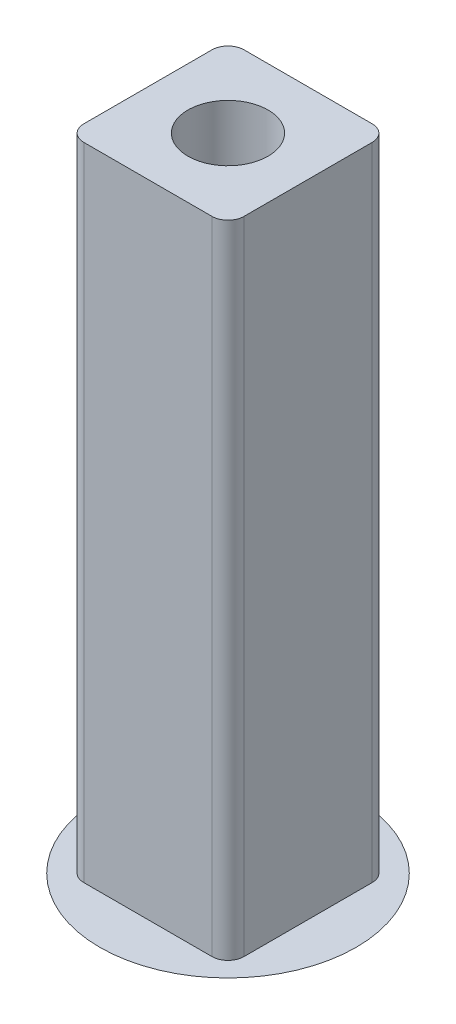
ISO-10303-21;
HEADER;
FILE_DESCRIPTION(('STEP AP214'),'2;1');
FILE_NAME('part.step','',(''),(''),'','','');
FILE_SCHEMA(('AUTOMOTIVE_DESIGN { 1 0 10303 214 1 1 1 1 }'));
ENDSEC;
DATA;
#1=APPLICATION_CONTEXT('core data for automotive mechanical design processes');
#2=APPLICATION_PROTOCOL_DEFINITION('international standard','automotive_design',2000,#1);
#3=PRODUCT_CONTEXT('',#1,'mechanical');
#4=PRODUCT('Part','Part','',(#3));
#5=PRODUCT_RELATED_PRODUCT_CATEGORY('part','',(#4));
#6=PRODUCT_DEFINITION_FORMATION('','',#4);
#7=PRODUCT_DEFINITION_CONTEXT('part definition',#1,'design');
#8=PRODUCT_DEFINITION('design','',#6,#7);
#9=PRODUCT_DEFINITION_SHAPE('','',#8);
#10=(LENGTH_UNIT() NAMED_UNIT(*) SI_UNIT(.MILLI.,.METRE.));
#11=(NAMED_UNIT(*) PLANE_ANGLE_UNIT() SI_UNIT($,.RADIAN.));
#12=(NAMED_UNIT(*) SI_UNIT($,.STERADIAN.) SOLID_ANGLE_UNIT());
#13=UNCERTAINTY_MEASURE_WITH_UNIT(LENGTH_MEASURE(1.E-05),#10,'distance_accuracy_value','');
#14=(GEOMETRIC_REPRESENTATION_CONTEXT(3) GLOBAL_UNCERTAINTY_ASSIGNED_CONTEXT((#13)) GLOBAL_UNIT_ASSIGNED_CONTEXT((#10,
#11,#12)) REPRESENTATION_CONTEXT('',''));
#15=CARTESIAN_POINT('',(0.,0.,0.));
#16=DIRECTION('',(0.,0.,1.));
#17=DIRECTION('',(1.,0.,0.));
#18=AXIS2_PLACEMENT_3D('',#15,#16,#17);
#19=CARTESIAN_POINT('',(2.,20.,-2.));
#20=DIRECTION('',(0.,-1.,0.));
#21=DIRECTION('',(0.,0.,-1.));
#22=AXIS2_PLACEMENT_3D('',#19,#20,#21);
#23=PLANE('',#22);
#24=CARTESIAN_POINT('',(2.,20.,-2.));
#25=DIRECTION('',(0.,1.,0.));
#26=DIRECTION('',(0.,0.,-1.));
#27=AXIS2_PLACEMENT_3D('',#24,#25,#26);
#28=CIRCLE('',#27,0.5);
#29=CARTESIAN_POINT('',(2.5,20.,-2.));
#30=VERTEX_POINT('',#29);
#31=CARTESIAN_POINT('',(2.,20.,-2.5));
#32=VERTEX_POINT('',#31);
#33=EDGE_CURVE('E125',#30,#32,#28,.T.);
#34=ORIENTED_EDGE('',*,*,#33,.T.);
#35=DIRECTION('',(-1.,0.,0.));
#36=VECTOR('',#35,1.);
#37=CARTESIAN_POINT('',(-2.,20.,-2.5));
#38=LINE('',#37,#36);
#39=CARTESIAN_POINT('',(-2.,20.,-2.5));
#40=VERTEX_POINT('',#39);
#41=EDGE_CURVE('E127',#32,#40,#38,.T.);
#42=ORIENTED_EDGE('',*,*,#41,.T.);
#43=CARTESIAN_POINT('',(-2.,20.,-2.));
#44=DIRECTION('',(0.,1.,0.));
#45=DIRECTION('',(0.,0.,-1.));
#46=AXIS2_PLACEMENT_3D('',#43,#44,#45);
#47=CIRCLE('',#46,0.5);
#48=CARTESIAN_POINT('',(-2.5,20.,-2.));
#49=VERTEX_POINT('',#48);
#50=EDGE_CURVE('E130',#40,#49,#47,.T.);
#51=ORIENTED_EDGE('',*,*,#50,.T.);
#52=DIRECTION('',(0.,0.,1.));
#53=VECTOR('',#52,1.);
#54=CARTESIAN_POINT('',(-2.5,20.,2.));
#55=LINE('',#54,#53);
#56=CARTESIAN_POINT('',(-2.5,20.,2.));
#57=VERTEX_POINT('',#56);
#58=EDGE_CURVE('E132',#49,#57,#55,.T.);
#59=ORIENTED_EDGE('',*,*,#58,.T.);
#60=CARTESIAN_POINT('',(-2.,20.,2.));
#61=DIRECTION('',(0.,1.,0.));
#62=DIRECTION('',(0.,0.,-1.));
#63=AXIS2_PLACEMENT_3D('',#60,#61,#62);
#64=CIRCLE('',#63,0.5);
#65=CARTESIAN_POINT('',(-2.,20.,2.5));
#66=VERTEX_POINT('',#65);
#67=EDGE_CURVE('E134',#57,#66,#64,.T.);
#68=ORIENTED_EDGE('',*,*,#67,.T.);
#69=DIRECTION('',(1.,0.,0.));
#70=VECTOR('',#69,1.);
#71=CARTESIAN_POINT('',(-2.,20.,2.5));
#72=LINE('',#71,#70);
#73=CARTESIAN_POINT('',(2.,20.,2.5));
#74=VERTEX_POINT('',#73);
#75=EDGE_CURVE('E136',#66,#74,#72,.T.);
#76=ORIENTED_EDGE('',*,*,#75,.T.);
#77=CARTESIAN_POINT('',(2.,20.,2.));
#78=DIRECTION('',(0.,1.,0.));
#79=DIRECTION('',(0.,0.,-1.));
#80=AXIS2_PLACEMENT_3D('',#77,#78,#79);
#81=CIRCLE('',#80,0.5);
#82=CARTESIAN_POINT('',(2.5,20.,2.));
#83=VERTEX_POINT('',#82);
#84=EDGE_CURVE('E138',#74,#83,#81,.T.);
#85=ORIENTED_EDGE('',*,*,#84,.T.);
#86=DIRECTION('',(0.,0.,-1.));
#87=VECTOR('',#86,1.);
#88=CARTESIAN_POINT('',(2.5,20.,2.));
#89=LINE('',#88,#87);
#90=EDGE_CURVE('E60',#83,#30,#89,.T.);
#91=ORIENTED_EDGE('',*,*,#90,.T.);
#92=EDGE_LOOP('',(#34,#42,#51,#59,#68,#76,#85,#91));
#93=FACE_BOUND('',#92,.T.);
#94=CARTESIAN_POINT('',(0.,20.,0.));
#95=DIRECTION('',(0.,1.,0.));
#96=DIRECTION('',(0.,0.,1.));
#97=AXIS2_PLACEMENT_3D('',#94,#95,#96);
#98=CIRCLE('',#97,1.25);
#99=CARTESIAN_POINT('',(0.,20.,1.25));
#100=VERTEX_POINT('',#99);
#101=EDGE_CURVE('E119',#100,#100,#98,.T.);
#102=ORIENTED_EDGE('',*,*,#101,.F.);
#103=EDGE_LOOP('',(#102));
#104=FACE_BOUND('',#103,.T.);
#105=ADVANCED_FACE('F44',(#93,#104),#23,.F.);
#106=CARTESIAN_POINT('',(2.,20.,-2.));
#107=DIRECTION('',(0.,-1.,0.));
#108=DIRECTION('',(0.,0.,-1.));
#109=AXIS2_PLACEMENT_3D('',#106,#107,#108);
#110=CYLINDRICAL_SURFACE('',#109,0.5);
#111=CARTESIAN_POINT('',(2.,0.,-2.));
#112=DIRECTION('',(0.,1.,0.));
#113=DIRECTION('',(0.,0.,-1.));
#114=AXIS2_PLACEMENT_3D('',#111,#112,#113);
#115=CIRCLE('',#114,0.5);
#116=CARTESIAN_POINT('',(2.5,0.,-2.));
#117=VERTEX_POINT('',#116);
#118=CARTESIAN_POINT('',(2.,0.,-2.5));
#119=VERTEX_POINT('',#118);
#120=EDGE_CURVE('E123',#117,#119,#115,.T.);
#121=ORIENTED_EDGE('',*,*,#120,.T.);
#122=DIRECTION('',(0.,-1.,0.));
#123=VECTOR('',#122,1.);
#124=CARTESIAN_POINT('',(2.,20.,-2.5));
#125=LINE('',#124,#123);
#126=EDGE_CURVE('E13',#32,#119,#125,.T.);
#127=ORIENTED_EDGE('',*,*,#126,.F.);
#128=ORIENTED_EDGE('',*,*,#33,.F.);
#129=DIRECTION('',(0.,-1.,0.));
#130=VECTOR('',#129,1.);
#131=CARTESIAN_POINT('',(2.5,20.,-2.));
#132=LINE('',#131,#130);
#133=EDGE_CURVE('E141',#30,#117,#132,.T.);
#134=ORIENTED_EDGE('',*,*,#133,.T.);
#135=EDGE_LOOP('',(#121,#127,#128,#134));
#136=FACE_BOUND('',#135,.T.);
#137=ADVANCED_FACE('F46',(#136),#110,.T.);
#138=CARTESIAN_POINT('',(-2.,20.,-2.5));
#139=DIRECTION('',(0.,0.,1.));
#140=DIRECTION('',(1.,0.,0.));
#141=AXIS2_PLACEMENT_3D('',#138,#139,#140);
#142=PLANE('',#141);
#143=DIRECTION('',(-1.,0.,0.));
#144=VECTOR('',#143,1.);
#145=CARTESIAN_POINT('',(-2.,0.,-2.5));
#146=LINE('',#145,#144);
#147=CARTESIAN_POINT('',(-2.,0.,-2.5));
#148=VERTEX_POINT('',#147);
#149=EDGE_CURVE('E144',#119,#148,#146,.T.);
#150=ORIENTED_EDGE('',*,*,#149,.T.);
#151=DIRECTION('',(0.,-1.,0.));
#152=VECTOR('',#151,1.);
#153=CARTESIAN_POINT('',(-2.,20.,-2.5));
#154=LINE('',#153,#152);
#155=EDGE_CURVE('E53',#40,#148,#154,.T.);
#156=ORIENTED_EDGE('',*,*,#155,.F.);
#157=ORIENTED_EDGE('',*,*,#41,.F.);
#158=ORIENTED_EDGE('',*,*,#126,.T.);
#159=EDGE_LOOP('',(#150,#156,#157,#158));
#160=FACE_BOUND('',#159,.T.);
#161=ADVANCED_FACE('F187',(#160),#142,.F.);
#162=CARTESIAN_POINT('',(-2.,20.,-2.));
#163=DIRECTION('',(0.,-1.,0.));
#164=DIRECTION('',(0.,0.,-1.));
#165=AXIS2_PLACEMENT_3D('',#162,#163,#164);
#166=CYLINDRICAL_SURFACE('',#165,0.5);
#167=CARTESIAN_POINT('',(-2.,0.,-2.));
#168=DIRECTION('',(0.,1.,0.));
#169=DIRECTION('',(0.,0.,-1.));
#170=AXIS2_PLACEMENT_3D('',#167,#168,#169);
#171=CIRCLE('',#170,0.5);
#172=CARTESIAN_POINT('',(-2.5,0.,-2.));
#173=VERTEX_POINT('',#172);
#174=EDGE_CURVE('E147',#148,#173,#171,.T.);
#175=ORIENTED_EDGE('',*,*,#174,.T.);
#176=DIRECTION('',(0.,-1.,0.));
#177=VECTOR('',#176,1.);
#178=CARTESIAN_POINT('',(-2.5,20.,-2.));
#179=LINE('',#178,#177);
#180=EDGE_CURVE('E178',#49,#173,#179,.T.);
#181=ORIENTED_EDGE('',*,*,#180,.F.);
#182=ORIENTED_EDGE('',*,*,#50,.F.);
#183=ORIENTED_EDGE('',*,*,#155,.T.);
#184=EDGE_LOOP('',(#175,#181,#182,#183));
#185=FACE_BOUND('',#184,.T.);
#186=ADVANCED_FACE('F184',(#185),#166,.T.);
#187=CARTESIAN_POINT('',(-2.5,20.,2.));
#188=DIRECTION('',(1.,0.,0.));
#189=DIRECTION('',(0.,0.,-1.));
#190=AXIS2_PLACEMENT_3D('',#187,#188,#189);
#191=PLANE('',#190);
#192=DIRECTION('',(0.,0.,1.));
#193=VECTOR('',#192,1.);
#194=CARTESIAN_POINT('',(-2.5,0.,2.));
#195=LINE('',#194,#193);
#196=CARTESIAN_POINT('',(-2.5,0.,2.));
#197=VERTEX_POINT('',#196);
#198=EDGE_CURVE('E150',#173,#197,#195,.T.);
#199=ORIENTED_EDGE('',*,*,#198,.T.);
#200=DIRECTION('',(0.,-1.,0.));
#201=VECTOR('',#200,1.);
#202=CARTESIAN_POINT('',(-2.5,20.,2.));
#203=LINE('',#202,#201);
#204=EDGE_CURVE('E175',#57,#197,#203,.T.);
#205=ORIENTED_EDGE('',*,*,#204,.F.);
#206=ORIENTED_EDGE('',*,*,#58,.F.);
#207=ORIENTED_EDGE('',*,*,#180,.T.);
#208=EDGE_LOOP('',(#199,#205,#206,#207));
#209=FACE_BOUND('',#208,.T.);
#210=ADVANCED_FACE('F193',(#209),#191,.F.);
#211=CARTESIAN_POINT('',(-2.,20.,2.));
#212=DIRECTION('',(0.,-1.,0.));
#213=DIRECTION('',(0.,0.,-1.));
#214=AXIS2_PLACEMENT_3D('',#211,#212,#213);
#215=CYLINDRICAL_SURFACE('',#214,0.5);
#216=CARTESIAN_POINT('',(-2.,0.,2.));
#217=DIRECTION('',(0.,1.,0.));
#218=DIRECTION('',(0.,0.,-1.));
#219=AXIS2_PLACEMENT_3D('',#216,#217,#218);
#220=CIRCLE('',#219,0.5);
#221=CARTESIAN_POINT('',(-2.,0.,2.5));
#222=VERTEX_POINT('',#221);
#223=EDGE_CURVE('E153',#197,#222,#220,.T.);
#224=ORIENTED_EDGE('',*,*,#223,.T.);
#225=DIRECTION('',(0.,-1.,0.));
#226=VECTOR('',#225,1.);
#227=CARTESIAN_POINT('',(-2.,20.,2.5));
#228=LINE('',#227,#226);
#229=EDGE_CURVE('E172',#66,#222,#228,.T.);
#230=ORIENTED_EDGE('',*,*,#229,.F.);
#231=ORIENTED_EDGE('',*,*,#67,.F.);
#232=ORIENTED_EDGE('',*,*,#204,.T.);
#233=EDGE_LOOP('',(#224,#230,#231,#232));
#234=FACE_BOUND('',#233,.T.);
#235=ADVANCED_FACE('F197',(#234),#215,.T.);
#236=CARTESIAN_POINT('',(-2.,20.,2.5));
#237=DIRECTION('',(0.,0.,-1.));
#238=DIRECTION('',(-1.,0.,0.));
#239=AXIS2_PLACEMENT_3D('',#236,#237,#238);
#240=PLANE('',#239);
#241=DIRECTION('',(1.,0.,0.));
#242=VECTOR('',#241,1.);
#243=CARTESIAN_POINT('',(-2.,0.,2.5));
#244=LINE('',#243,#242);
#245=CARTESIAN_POINT('',(2.,0.,2.5));
#246=VERTEX_POINT('',#245);
#247=EDGE_CURVE('E156',#222,#246,#244,.T.);
#248=ORIENTED_EDGE('',*,*,#247,.T.);
#249=DIRECTION('',(0.,-1.,0.));
#250=VECTOR('',#249,1.);
#251=CARTESIAN_POINT('',(2.,20.,2.5));
#252=LINE('',#251,#250);
#253=EDGE_CURVE('E169',#74,#246,#252,.T.);
#254=ORIENTED_EDGE('',*,*,#253,.F.);
#255=ORIENTED_EDGE('',*,*,#75,.F.);
#256=ORIENTED_EDGE('',*,*,#229,.T.);
#257=EDGE_LOOP('',(#248,#254,#255,#256));
#258=FACE_BOUND('',#257,.T.);
#259=ADVANCED_FACE('F211',(#258),#240,.F.);
#260=CARTESIAN_POINT('',(2.,20.,2.));
#261=DIRECTION('',(0.,-1.,0.));
#262=DIRECTION('',(0.,0.,-1.));
#263=AXIS2_PLACEMENT_3D('',#260,#261,#262);
#264=CYLINDRICAL_SURFACE('',#263,0.5);
#265=CARTESIAN_POINT('',(2.,0.,2.));
#266=DIRECTION('',(0.,1.,0.));
#267=DIRECTION('',(0.,0.,-1.));
#268=AXIS2_PLACEMENT_3D('',#265,#266,#267);
#269=CIRCLE('',#268,0.5);
#270=CARTESIAN_POINT('',(2.5,0.,2.));
#271=VERTEX_POINT('',#270);
#272=EDGE_CURVE('E159',#246,#271,#269,.T.);
#273=ORIENTED_EDGE('',*,*,#272,.T.);
#274=DIRECTION('',(0.,-1.,0.));
#275=VECTOR('',#274,1.);
#276=CARTESIAN_POINT('',(2.5,20.,2.));
#277=LINE('',#276,#275);
#278=EDGE_CURVE('E166',#83,#271,#277,.T.);
#279=ORIENTED_EDGE('',*,*,#278,.F.);
#280=ORIENTED_EDGE('',*,*,#84,.F.);
#281=ORIENTED_EDGE('',*,*,#253,.T.);
#282=EDGE_LOOP('',(#273,#279,#280,#281));
#283=FACE_BOUND('',#282,.T.);
#284=ADVANCED_FACE('F208',(#283),#264,.T.);
#285=CARTESIAN_POINT('',(2.5,20.,2.));
#286=DIRECTION('',(-1.,0.,0.));
#287=DIRECTION('',(0.,0.,1.));
#288=AXIS2_PLACEMENT_3D('',#285,#286,#287);
#289=PLANE('',#288);
#290=DIRECTION('',(0.,0.,-1.));
#291=VECTOR('',#290,1.);
#292=CARTESIAN_POINT('',(2.5,0.,2.));
#293=LINE('',#292,#291);
#294=EDGE_CURVE('E128',#271,#117,#293,.T.);
#295=ORIENTED_EDGE('',*,*,#294,.T.);
#296=ORIENTED_EDGE('',*,*,#133,.F.);
#297=ORIENTED_EDGE('',*,*,#90,.F.);
#298=ORIENTED_EDGE('',*,*,#278,.T.);
#299=EDGE_LOOP('',(#295,#296,#297,#298));
#300=FACE_BOUND('',#299,.T.);
#301=ADVANCED_FACE('F205',(#300),#289,.F.);
#302=CARTESIAN_POINT('',(0.,20.,0.));
#303=DIRECTION('',(0.,-1.,0.));
#304=DIRECTION('',(0.,0.,-1.));
#305=AXIS2_PLACEMENT_3D('',#302,#303,#304);
#306=CYLINDRICAL_SURFACE('',#305,1.25);
#307=ORIENTED_EDGE('',*,*,#101,.T.);
#308=EDGE_LOOP('',(#307));
#309=FACE_BOUND('',#308,.T.);
#310=CARTESIAN_POINT('',(0.,0.,0.));
#311=DIRECTION('',(0.,1.,0.));
#312=DIRECTION('',(0.,0.,1.));
#313=AXIS2_PLACEMENT_3D('',#310,#311,#312);
#314=CIRCLE('',#313,1.25);
#315=CARTESIAN_POINT('',(0.,0.,1.25));
#316=VERTEX_POINT('',#315);
#317=EDGE_CURVE('E116',#316,#316,#314,.T.);
#318=ORIENTED_EDGE('',*,*,#317,.F.);
#319=EDGE_LOOP('',(#318));
#320=FACE_BOUND('',#319,.T.);
#321=ADVANCED_FACE('F227',(#309,#320),#306,.F.);
#322=CARTESIAN_POINT('',(0.,0.,0.));
#323=DIRECTION('',(0.,-1.,0.));
#324=DIRECTION('',(0.,0.,-1.));
#325=AXIS2_PLACEMENT_3D('',#322,#323,#324);
#326=PLANE('',#325);
#327=ORIENTED_EDGE('',*,*,#317,.T.);
#328=EDGE_LOOP('',(#327));
#329=FACE_BOUND('',#328,.T.);
#330=ADVANCED_FACE('F110',(#329),#326,.F.);
#331=CARTESIAN_POINT('',(0.,0.,0.));
#332=DIRECTION('',(0.,1.,0.));
#333=DIRECTION('',(0.,0.,-1.));
#334=AXIS2_PLACEMENT_3D('',#331,#332,#333);
#335=CONICAL_SURFACE('',#334,4.,1.11701072127637);
#336=CARTESIAN_POINT('',(0.,-1.95093035426344,0.));
#337=VERTEX_POINT('',#336);
#338=VERTEX_LOOP('',#337);
#339=FACE_BOUND('',#338,.T.);
#340=CARTESIAN_POINT('',(0.,0.,0.));
#341=DIRECTION('',(0.,-1.,0.));
#342=DIRECTION('',(0.,0.,-1.));
#343=AXIS2_PLACEMENT_3D('',#340,#341,#342);
#344=CIRCLE('',#343,4.);
#345=CARTESIAN_POINT('',(0.,0.,-4.));
#346=VERTEX_POINT('',#345);
#347=EDGE_CURVE('E114',#346,#346,#344,.T.);
#348=ORIENTED_EDGE('',*,*,#347,.T.);
#349=EDGE_LOOP('',(#348));
#350=FACE_BOUND('',#349,.T.);
#351=ADVANCED_FACE('F106',(#339,#350),#335,.T.);
#352=ORIENTED_EDGE('',*,*,#149,.F.);
#353=ORIENTED_EDGE('',*,*,#120,.F.);
#354=ORIENTED_EDGE('',*,*,#294,.F.);
#355=ORIENTED_EDGE('',*,*,#272,.F.);
#356=ORIENTED_EDGE('',*,*,#247,.F.);
#357=ORIENTED_EDGE('',*,*,#223,.F.);
#358=ORIENTED_EDGE('',*,*,#198,.F.);
#359=ORIENTED_EDGE('',*,*,#174,.F.);
#360=EDGE_LOOP('',(#352,#353,#354,#355,#356,#357,#358,#359));
#361=FACE_BOUND('',#360,.T.);
#362=ORIENTED_EDGE('',*,*,#347,.F.);
#363=EDGE_LOOP('',(#362));
#364=FACE_BOUND('',#363,.T.);
#365=ADVANCED_FACE('F109',(#361,#364),#326,.F.);
#366=CLOSED_SHELL('',(#105,#137,#161,#186,#210,#235,#259,#284,#301,#321,#330,#351,#365));
#367=MANIFOLD_SOLID_BREP('B2',#366);
#368=ADVANCED_BREP_SHAPE_REPRESENTATION('',(#18,#367),#14);
#369=SHAPE_DEFINITION_REPRESENTATION(#9,#368);
ENDSEC;
END-ISO-10303-21;
